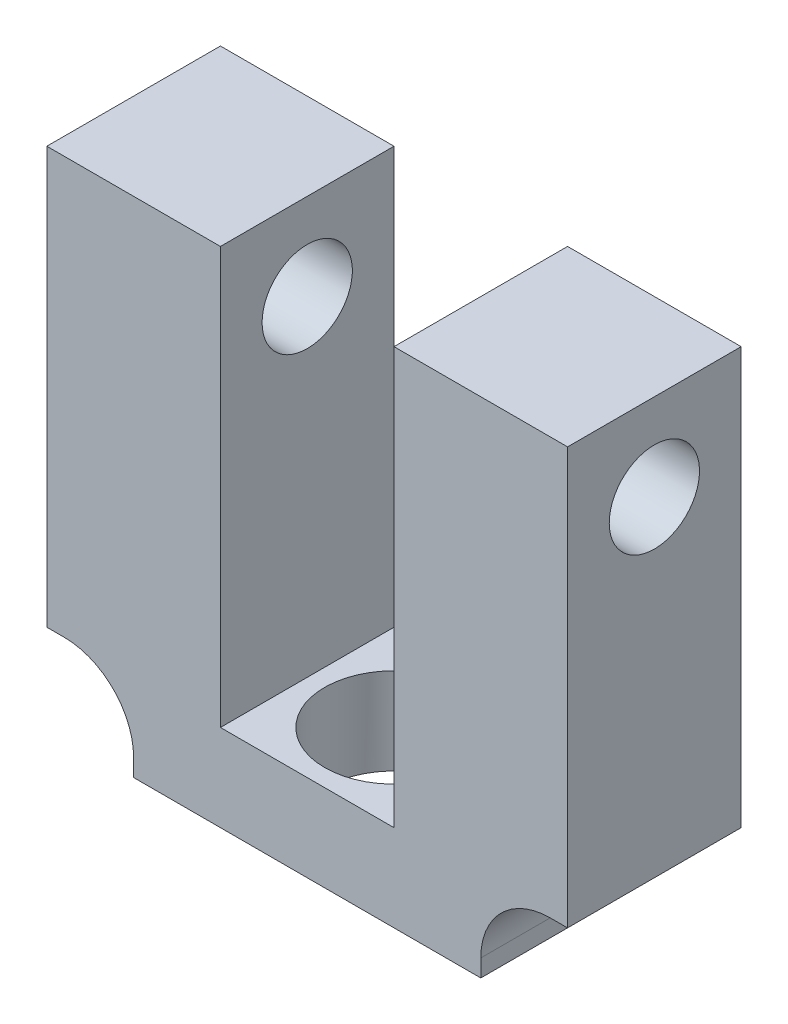
ISO-10303-21;
HEADER;
FILE_DESCRIPTION(('STEP AP214'),'2;1');
FILE_NAME('part.step','',(''),(''),'','','');
FILE_SCHEMA(('AUTOMOTIVE_DESIGN { 1 0 10303 214 1 1 1 1 }'));
ENDSEC;
DATA;
#1=APPLICATION_CONTEXT('core data for automotive mechanical design processes');
#2=APPLICATION_PROTOCOL_DEFINITION('international standard','automotive_design',2000,#1);
#3=PRODUCT_CONTEXT('',#1,'mechanical');
#4=PRODUCT('Part','Part','',(#3));
#5=PRODUCT_RELATED_PRODUCT_CATEGORY('part','',(#4));
#6=PRODUCT_DEFINITION_FORMATION('','',#4);
#7=PRODUCT_DEFINITION_CONTEXT('part definition',#1,'design');
#8=PRODUCT_DEFINITION('design','',#6,#7);
#9=PRODUCT_DEFINITION_SHAPE('','',#8);
#10=(LENGTH_UNIT() NAMED_UNIT(*) SI_UNIT(.MILLI.,.METRE.));
#11=(NAMED_UNIT(*) PLANE_ANGLE_UNIT() SI_UNIT($,.RADIAN.));
#12=(NAMED_UNIT(*) SI_UNIT($,.STERADIAN.) SOLID_ANGLE_UNIT());
#13=UNCERTAINTY_MEASURE_WITH_UNIT(LENGTH_MEASURE(1.E-05),#10,'distance_accuracy_value','');
#14=(GEOMETRIC_REPRESENTATION_CONTEXT(3) GLOBAL_UNCERTAINTY_ASSIGNED_CONTEXT((#13)) GLOBAL_UNIT_ASSIGNED_CONTEXT((#10,
#11,#12)) REPRESENTATION_CONTEXT('',''));
#15=CARTESIAN_POINT('',(0.,0.,0.));
#16=DIRECTION('',(0.,0.,1.));
#17=DIRECTION('',(1.,0.,0.));
#18=AXIS2_PLACEMENT_3D('',#15,#16,#17);
#19=CARTESIAN_POINT('',(0.,3.175,0.));
#20=DIRECTION('',(0.,-1.,0.));
#21=DIRECTION('',(0.,0.,-1.));
#22=AXIS2_PLACEMENT_3D('',#19,#20,#21);
#23=PLANE('',#22);
#24=CARTESIAN_POINT('',(6.35,3.175,-3.175));
#25=DIRECTION('',(0.,1.,0.));
#26=DIRECTION('',(0.,0.,1.));
#27=AXIS2_PLACEMENT_3D('',#24,#25,#26);
#28=CIRCLE('',#27,2.54);
#29=CARTESIAN_POINT('',(6.35,3.175,-0.634999999999999));
#30=VERTEX_POINT('',#29);
#31=EDGE_CURVE('E259',#30,#30,#28,.T.);
#32=ORIENTED_EDGE('',*,*,#31,.F.);
#33=EDGE_LOOP('',(#32));
#34=FACE_BOUND('',#33,.T.);
#35=DIRECTION('',(0.,0.,1.));
#36=VECTOR('',#35,1.);
#37=CARTESIAN_POINT('',(9.525,3.175,-6.35));
#38=LINE('',#37,#36);
#39=CARTESIAN_POINT('',(9.525,3.175,-6.35));
#40=VERTEX_POINT('',#39);
#41=CARTESIAN_POINT('',(9.525,3.175,0.));
#42=VERTEX_POINT('',#41);
#43=EDGE_CURVE('E170',#40,#42,#38,.T.);
#44=ORIENTED_EDGE('',*,*,#43,.F.);
#45=DIRECTION('',(-1.,0.,0.));
#46=VECTOR('',#45,1.);
#47=CARTESIAN_POINT('',(0.,3.175,-6.35));
#48=LINE('',#47,#46);
#49=CARTESIAN_POINT('',(3.175,3.175,-6.35));
#50=VERTEX_POINT('',#49);
#51=EDGE_CURVE('E214',#40,#50,#48,.T.);
#52=ORIENTED_EDGE('',*,*,#51,.T.);
#53=DIRECTION('',(0.,0.,-1.));
#54=VECTOR('',#53,1.);
#55=CARTESIAN_POINT('',(3.175,3.175,-6.35));
#56=LINE('',#55,#54);
#57=CARTESIAN_POINT('',(3.175,3.175,0.));
#58=VERTEX_POINT('',#57);
#59=EDGE_CURVE('E188',#58,#50,#56,.T.);
#60=ORIENTED_EDGE('',*,*,#59,.F.);
#61=DIRECTION('',(1.,0.,0.));
#62=VECTOR('',#61,1.);
#63=CARTESIAN_POINT('',(0.,3.175,0.));
#64=LINE('',#63,#62);
#65=EDGE_CURVE('E212',#58,#42,#64,.T.);
#66=ORIENTED_EDGE('',*,*,#65,.T.);
#67=EDGE_LOOP('',(#44,#52,#60,#66));
#68=FACE_BOUND('',#67,.T.);
#69=ADVANCED_FACE('F40',(#34,#68),#23,.F.);
#70=CARTESIAN_POINT('',(0.,3.175,0.));
#71=DIRECTION('',(1.,0.,0.));
#72=DIRECTION('',(0.,0.,-1.));
#73=AXIS2_PLACEMENT_3D('',#70,#71,#72);
#74=PLANE('',#73);
#75=DIRECTION('',(0.,-1.,0.));
#76=VECTOR('',#75,1.);
#77=CARTESIAN_POINT('',(0.,3.175,0.));
#78=LINE('',#77,#76);
#79=CARTESIAN_POINT('',(0.,0.635,0.));
#80=VERTEX_POINT('',#79);
#81=CARTESIAN_POINT('',(0.,0.,0.));
#82=VERTEX_POINT('',#81);
#83=EDGE_CURVE('E232',#80,#82,#78,.T.);
#84=ORIENTED_EDGE('',*,*,#83,.F.);
#85=DIRECTION('',(0.,0.,1.));
#86=VECTOR('',#85,1.);
#87=CARTESIAN_POINT('',(0.,0.635,-6.35));
#88=LINE('',#87,#86);
#89=CARTESIAN_POINT('',(0.,0.635,-6.35));
#90=VERTEX_POINT('',#89);
#91=EDGE_CURVE('E57',#80,#90,#88,.F.);
#92=ORIENTED_EDGE('',*,*,#91,.T.);
#93=DIRECTION('',(0.,-1.,0.));
#94=VECTOR('',#93,1.);
#95=CARTESIAN_POINT('',(0.,3.175,-6.35));
#96=LINE('',#95,#94);
#97=CARTESIAN_POINT('',(0.,0.,-6.35));
#98=VERTEX_POINT('',#97);
#99=EDGE_CURVE('E217',#90,#98,#96,.T.);
#100=ORIENTED_EDGE('',*,*,#99,.T.);
#101=DIRECTION('',(0.,0.,1.));
#102=VECTOR('',#101,1.);
#103=CARTESIAN_POINT('',(0.,0.,0.));
#104=LINE('',#103,#102);
#105=EDGE_CURVE('E211',#98,#82,#104,.T.);
#106=ORIENTED_EDGE('',*,*,#105,.T.);
#107=EDGE_LOOP('',(#84,#92,#100,#106));
#108=FACE_BOUND('',#107,.T.);
#109=ADVANCED_FACE('F327',(#108),#74,.F.);
#110=CARTESIAN_POINT('',(0.,3.175,0.));
#111=DIRECTION('',(0.,0.,-1.));
#112=DIRECTION('',(-1.,0.,0.));
#113=AXIS2_PLACEMENT_3D('',#110,#111,#112);
#114=PLANE('',#113);
#115=DIRECTION('',(1.,0.,0.));
#116=VECTOR('',#115,1.);
#117=CARTESIAN_POINT('',(0.,0.,0.));
#118=LINE('',#117,#116);
#119=CARTESIAN_POINT('',(12.7,0.,0.));
#120=VERTEX_POINT('',#119);
#121=EDGE_CURVE('E220',#82,#120,#118,.T.);
#122=ORIENTED_EDGE('',*,*,#121,.T.);
#123=DIRECTION('',(0.,-1.,0.));
#124=VECTOR('',#123,1.);
#125=CARTESIAN_POINT('',(12.7,3.175,0.));
#126=LINE('',#125,#124);
#127=CARTESIAN_POINT('',(12.7,0.635,0.));
#128=VERTEX_POINT('',#127);
#129=EDGE_CURVE('E230',#128,#120,#126,.T.);
#130=ORIENTED_EDGE('',*,*,#129,.F.);
#131=CARTESIAN_POINT('',(15.24,0.635,0.));
#132=DIRECTION('',(0.,0.,-1.));
#133=DIRECTION('',(-1.,0.,0.));
#134=AXIS2_PLACEMENT_3D('',#131,#132,#133);
#135=CIRCLE('',#134,2.54);
#136=CARTESIAN_POINT('',(15.24,3.175,0.));
#137=VERTEX_POINT('',#136);
#138=EDGE_CURVE('E243',#128,#137,#135,.T.);
#139=ORIENTED_EDGE('',*,*,#138,.T.);
#140=DIRECTION('',(1.,0.,0.));
#141=VECTOR('',#140,1.);
#142=CARTESIAN_POINT('',(9.525,3.175,0.));
#143=LINE('',#142,#141);
#144=CARTESIAN_POINT('',(15.875,3.175,0.));
#145=VERTEX_POINT('',#144);
#146=EDGE_CURVE('E153',#137,#145,#143,.T.);
#147=ORIENTED_EDGE('',*,*,#146,.T.);
#148=DIRECTION('',(0.,-1.,0.));
#149=VECTOR('',#148,1.);
#150=CARTESIAN_POINT('',(15.875,18.415,0.));
#151=LINE('',#150,#149);
#152=CARTESIAN_POINT('',(15.875,18.415,0.));
#153=VERTEX_POINT('',#152);
#154=EDGE_CURVE('E149',#153,#145,#151,.T.);
#155=ORIENTED_EDGE('',*,*,#154,.F.);
#156=DIRECTION('',(1.,0.,0.));
#157=VECTOR('',#156,1.);
#158=CARTESIAN_POINT('',(9.525,18.415,0.));
#159=LINE('',#158,#157);
#160=CARTESIAN_POINT('',(9.525,18.415,0.));
#161=VERTEX_POINT('',#160);
#162=EDGE_CURVE('E179',#161,#153,#159,.T.);
#163=ORIENTED_EDGE('',*,*,#162,.F.);
#164=DIRECTION('',(0.,-1.,0.));
#165=VECTOR('',#164,1.);
#166=CARTESIAN_POINT('',(9.525,18.415,0.));
#167=LINE('',#166,#165);
#168=EDGE_CURVE('E267',#161,#42,#167,.T.);
#169=ORIENTED_EDGE('',*,*,#168,.T.);
#170=ORIENTED_EDGE('',*,*,#65,.F.);
#171=DIRECTION('',(0.,-1.,0.));
#172=VECTOR('',#171,1.);
#173=CARTESIAN_POINT('',(3.175,18.415,0.));
#174=LINE('',#173,#172);
#175=CARTESIAN_POINT('',(3.175,18.415,0.));
#176=VERTEX_POINT('',#175);
#177=EDGE_CURVE('E202',#176,#58,#174,.T.);
#178=ORIENTED_EDGE('',*,*,#177,.F.);
#179=DIRECTION('',(1.,0.,0.));
#180=VECTOR('',#179,1.);
#181=CARTESIAN_POINT('',(3.175,18.415,0.));
#182=LINE('',#181,#180);
#183=CARTESIAN_POINT('',(-3.175,18.415,0.));
#184=VERTEX_POINT('',#183);
#185=EDGE_CURVE('E190',#184,#176,#182,.T.);
#186=ORIENTED_EDGE('',*,*,#185,.F.);
#187=DIRECTION('',(0.,-1.,0.));
#188=VECTOR('',#187,1.);
#189=CARTESIAN_POINT('',(-3.175,18.415,0.));
#190=LINE('',#189,#188);
#191=CARTESIAN_POINT('',(-3.175,3.175,0.));
#192=VERTEX_POINT('',#191);
#193=EDGE_CURVE('E205',#184,#192,#190,.T.);
#194=ORIENTED_EDGE('',*,*,#193,.T.);
#195=DIRECTION('',(1.,0.,0.));
#196=VECTOR('',#195,1.);
#197=CARTESIAN_POINT('',(3.175,3.175,0.));
#198=LINE('',#197,#196);
#199=CARTESIAN_POINT('',(-2.54,3.175,0.));
#200=VERTEX_POINT('',#199);
#201=EDGE_CURVE('E196',#192,#200,#198,.T.);
#202=ORIENTED_EDGE('',*,*,#201,.T.);
#203=CARTESIAN_POINT('',(-2.54,0.635,0.));
#204=DIRECTION('',(0.,0.,-1.));
#205=DIRECTION('',(-1.,0.,0.));
#206=AXIS2_PLACEMENT_3D('',#203,#204,#205);
#207=CIRCLE('',#206,2.54);
#208=EDGE_CURVE('E49',#200,#80,#207,.T.);
#209=ORIENTED_EDGE('',*,*,#208,.T.);
#210=ORIENTED_EDGE('',*,*,#83,.T.);
#211=EDGE_LOOP('',(#122,#130,#139,#147,#155,#163,#169,#170,#178,#186,#194,#202,#209,#210));
#212=FACE_BOUND('',#211,.T.);
#213=ADVANCED_FACE('F270',(#212),#114,.F.);
#214=CARTESIAN_POINT('',(12.7,3.175,0.));
#215=DIRECTION('',(-1.,0.,0.));
#216=DIRECTION('',(0.,0.,1.));
#217=AXIS2_PLACEMENT_3D('',#214,#215,#216);
#218=PLANE('',#217);
#219=DIRECTION('',(0.,-1.,0.));
#220=VECTOR('',#219,1.);
#221=CARTESIAN_POINT('',(12.7,3.175,-6.35));
#222=LINE('',#221,#220);
#223=CARTESIAN_POINT('',(12.7,0.635,-6.35));
#224=VERTEX_POINT('',#223);
#225=CARTESIAN_POINT('',(12.7,0.,-6.35));
#226=VERTEX_POINT('',#225);
#227=EDGE_CURVE('E228',#224,#226,#222,.T.);
#228=ORIENTED_EDGE('',*,*,#227,.F.);
#229=DIRECTION('',(0.,0.,-1.));
#230=VECTOR('',#229,1.);
#231=CARTESIAN_POINT('',(12.7,0.635,0.));
#232=LINE('',#231,#230);
#233=EDGE_CURVE('E235',#224,#128,#232,.F.);
#234=ORIENTED_EDGE('',*,*,#233,.T.);
#235=ORIENTED_EDGE('',*,*,#129,.T.);
#236=DIRECTION('',(0.,0.,-1.));
#237=VECTOR('',#236,1.);
#238=CARTESIAN_POINT('',(12.7,0.,0.));
#239=LINE('',#238,#237);
#240=EDGE_CURVE('E223',#120,#226,#239,.T.);
#241=ORIENTED_EDGE('',*,*,#240,.T.);
#242=EDGE_LOOP('',(#228,#234,#235,#241));
#243=FACE_BOUND('',#242,.T.);
#244=ADVANCED_FACE('F279',(#243),#218,.F.);
#245=CARTESIAN_POINT('',(0.,3.175,-6.35));
#246=DIRECTION('',(0.,0.,1.));
#247=DIRECTION('',(1.,0.,0.));
#248=AXIS2_PLACEMENT_3D('',#245,#246,#247);
#249=PLANE('',#248);
#250=DIRECTION('',(-1.,0.,0.));
#251=VECTOR('',#250,1.);
#252=CARTESIAN_POINT('',(0.,0.,-6.35));
#253=LINE('',#252,#251);
#254=EDGE_CURVE('E215',#226,#98,#253,.T.);
#255=ORIENTED_EDGE('',*,*,#254,.T.);
#256=ORIENTED_EDGE('',*,*,#99,.F.);
#257=CARTESIAN_POINT('',(-2.54,0.635,-6.35));
#258=DIRECTION('',(0.,0.,1.));
#259=DIRECTION('',(1.,0.,0.));
#260=AXIS2_PLACEMENT_3D('',#257,#258,#259);
#261=CIRCLE('',#260,2.54);
#262=CARTESIAN_POINT('',(-2.54,3.175,-6.35));
#263=VERTEX_POINT('',#262);
#264=EDGE_CURVE('E11',#90,#263,#261,.T.);
#265=ORIENTED_EDGE('',*,*,#264,.T.);
#266=DIRECTION('',(-1.,0.,0.));
#267=VECTOR('',#266,1.);
#268=CARTESIAN_POINT('',(3.175,3.175,-6.35));
#269=LINE('',#268,#267);
#270=CARTESIAN_POINT('',(-3.175,3.175,-6.35));
#271=VERTEX_POINT('',#270);
#272=EDGE_CURVE('E169',#263,#271,#269,.T.);
#273=ORIENTED_EDGE('',*,*,#272,.T.);
#274=DIRECTION('',(0.,-1.,0.));
#275=VECTOR('',#274,1.);
#276=CARTESIAN_POINT('',(-3.175,18.415,-6.35));
#277=LINE('',#276,#275);
#278=CARTESIAN_POINT('',(-3.175,18.415,-6.35));
#279=VERTEX_POINT('',#278);
#280=EDGE_CURVE('E208',#279,#271,#277,.T.);
#281=ORIENTED_EDGE('',*,*,#280,.F.);
#282=DIRECTION('',(-1.,0.,0.));
#283=VECTOR('',#282,1.);
#284=CARTESIAN_POINT('',(3.175,18.415,-6.35));
#285=LINE('',#284,#283);
#286=CARTESIAN_POINT('',(3.175,18.415,-6.35));
#287=VERTEX_POINT('',#286);
#288=EDGE_CURVE('E184',#287,#279,#285,.T.);
#289=ORIENTED_EDGE('',*,*,#288,.F.);
#290=DIRECTION('',(0.,-1.,0.));
#291=VECTOR('',#290,1.);
#292=CARTESIAN_POINT('',(3.175,18.415,-6.35));
#293=LINE('',#292,#291);
#294=EDGE_CURVE('E193',#287,#50,#293,.T.);
#295=ORIENTED_EDGE('',*,*,#294,.T.);
#296=ORIENTED_EDGE('',*,*,#51,.F.);
#297=DIRECTION('',(0.,-1.,0.));
#298=VECTOR('',#297,1.);
#299=CARTESIAN_POINT('',(9.525,18.415,-6.35));
#300=LINE('',#299,#298);
#301=CARTESIAN_POINT('',(9.525,18.415,-6.35));
#302=VERTEX_POINT('',#301);
#303=EDGE_CURVE('E264',#302,#40,#300,.T.);
#304=ORIENTED_EDGE('',*,*,#303,.F.);
#305=DIRECTION('',(-1.,0.,0.));
#306=VECTOR('',#305,1.);
#307=CARTESIAN_POINT('',(9.525,18.415,-6.35));
#308=LINE('',#307,#306);
#309=CARTESIAN_POINT('',(15.875,18.415,-6.35));
#310=VERTEX_POINT('',#309);
#311=EDGE_CURVE('E154',#310,#302,#308,.T.);
#312=ORIENTED_EDGE('',*,*,#311,.F.);
#313=DIRECTION('',(0.,-1.,0.));
#314=VECTOR('',#313,1.);
#315=CARTESIAN_POINT('',(15.875,18.415,-6.35));
#316=LINE('',#315,#314);
#317=CARTESIAN_POINT('',(15.875,3.175,-6.35));
#318=VERTEX_POINT('',#317);
#319=EDGE_CURVE('E146',#310,#318,#316,.T.);
#320=ORIENTED_EDGE('',*,*,#319,.T.);
#321=DIRECTION('',(-1.,0.,0.));
#322=VECTOR('',#321,1.);
#323=CARTESIAN_POINT('',(9.525,3.175,-6.35));
#324=LINE('',#323,#322);
#325=CARTESIAN_POINT('',(15.24,3.175,-6.35));
#326=VERTEX_POINT('',#325);
#327=EDGE_CURVE('E160',#318,#326,#324,.T.);
#328=ORIENTED_EDGE('',*,*,#327,.T.);
#329=CARTESIAN_POINT('',(15.24,0.635,-6.35));
#330=DIRECTION('',(0.,0.,1.));
#331=DIRECTION('',(1.,0.,0.));
#332=AXIS2_PLACEMENT_3D('',#329,#330,#331);
#333=CIRCLE('',#332,2.54);
#334=EDGE_CURVE('E241',#326,#224,#333,.T.);
#335=ORIENTED_EDGE('',*,*,#334,.T.);
#336=ORIENTED_EDGE('',*,*,#227,.T.);
#337=EDGE_LOOP('',(#255,#256,#265,#273,#281,#289,#295,#296,#304,#312,#320,#328,#335,#336));
#338=FACE_BOUND('',#337,.T.);
#339=ADVANCED_FACE('F159',(#338),#249,.F.);
#340=CARTESIAN_POINT('',(0.,0.,0.));
#341=DIRECTION('',(0.,-1.,0.));
#342=DIRECTION('',(0.,0.,-1.));
#343=AXIS2_PLACEMENT_3D('',#340,#341,#342);
#344=PLANE('',#343);
#345=CARTESIAN_POINT('',(6.35,0.,-3.175));
#346=DIRECTION('',(0.,-1.,0.));
#347=DIRECTION('',(0.,0.,-1.));
#348=AXIS2_PLACEMENT_3D('',#345,#346,#347);
#349=CIRCLE('',#348,2.54);
#350=CARTESIAN_POINT('',(6.35,0.,-5.715));
#351=VERTEX_POINT('',#350);
#352=EDGE_CURVE('E44',#351,#351,#349,.T.);
#353=ORIENTED_EDGE('',*,*,#352,.F.);
#354=EDGE_LOOP('',(#353));
#355=FACE_BOUND('',#354,.T.);
#356=ORIENTED_EDGE('',*,*,#105,.F.);
#357=ORIENTED_EDGE('',*,*,#254,.F.);
#358=ORIENTED_EDGE('',*,*,#240,.F.);
#359=ORIENTED_EDGE('',*,*,#121,.F.);
#360=EDGE_LOOP('',(#356,#357,#358,#359));
#361=FACE_BOUND('',#360,.T.);
#362=ADVANCED_FACE('F285',(#355,#361),#344,.T.);
#363=CARTESIAN_POINT('',(0.,3.175,0.));
#364=DIRECTION('',(0.,1.,0.));
#365=DIRECTION('',(0.,0.,1.));
#366=AXIS2_PLACEMENT_3D('',#363,#364,#365);
#367=PLANE('',#366);
#368=ORIENTED_EDGE('',*,*,#272,.F.);
#369=DIRECTION('',(0.,0.,1.));
#370=VECTOR('',#369,1.);
#371=CARTESIAN_POINT('',(-2.54,3.175,0.));
#372=LINE('',#371,#370);
#373=EDGE_CURVE('E237',#263,#200,#372,.T.);
#374=ORIENTED_EDGE('',*,*,#373,.T.);
#375=ORIENTED_EDGE('',*,*,#201,.F.);
#376=DIRECTION('',(0.,0.,1.));
#377=VECTOR('',#376,1.);
#378=CARTESIAN_POINT('',(-3.175,3.175,-6.35));
#379=LINE('',#378,#377);
#380=EDGE_CURVE('E172',#271,#192,#379,.T.);
#381=ORIENTED_EDGE('',*,*,#380,.F.);
#382=EDGE_LOOP('',(#368,#374,#375,#381));
#383=FACE_BOUND('',#382,.T.);
#384=ADVANCED_FACE('F292',(#383),#367,.F.);
#385=CARTESIAN_POINT('',(-3.175,18.415,-6.35));
#386=DIRECTION('',(1.,0.,0.));
#387=DIRECTION('',(0.,0.,-1.));
#388=AXIS2_PLACEMENT_3D('',#385,#386,#387);
#389=PLANE('',#388);
#390=CARTESIAN_POINT('',(-3.175,15.24,-3.175));
#391=DIRECTION('',(-1.,0.,0.));
#392=DIRECTION('',(0.,0.,1.));
#393=AXIS2_PLACEMENT_3D('',#390,#391,#392);
#394=CIRCLE('',#393,1.651);
#395=CARTESIAN_POINT('',(-3.175,15.24,-1.524));
#396=VERTEX_POINT('',#395);
#397=EDGE_CURVE('E248',#396,#396,#394,.T.);
#398=ORIENTED_EDGE('',*,*,#397,.F.);
#399=EDGE_LOOP('',(#398));
#400=FACE_BOUND('',#399,.T.);
#401=ORIENTED_EDGE('',*,*,#380,.T.);
#402=ORIENTED_EDGE('',*,*,#193,.F.);
#403=DIRECTION('',(0.,0.,1.));
#404=VECTOR('',#403,1.);
#405=CARTESIAN_POINT('',(-3.175,18.415,-6.35));
#406=LINE('',#405,#404);
#407=EDGE_CURVE('E187',#279,#184,#406,.T.);
#408=ORIENTED_EDGE('',*,*,#407,.F.);
#409=ORIENTED_EDGE('',*,*,#280,.T.);
#410=EDGE_LOOP('',(#401,#402,#408,#409));
#411=FACE_BOUND('',#410,.T.);
#412=ADVANCED_FACE('F298',(#400,#411),#389,.F.);
#413=CARTESIAN_POINT('',(3.175,18.415,-6.35));
#414=DIRECTION('',(-1.,0.,0.));
#415=DIRECTION('',(0.,0.,1.));
#416=AXIS2_PLACEMENT_3D('',#413,#414,#415);
#417=PLANE('',#416);
#418=CARTESIAN_POINT('',(3.175,15.24,-3.175));
#419=DIRECTION('',(-1.,0.,0.));
#420=DIRECTION('',(0.,0.,1.));
#421=AXIS2_PLACEMENT_3D('',#418,#419,#420);
#422=CIRCLE('',#421,1.651);
#423=CARTESIAN_POINT('',(3.175,15.24,-1.524));
#424=VERTEX_POINT('',#423);
#425=EDGE_CURVE('E252',#424,#424,#422,.T.);
#426=ORIENTED_EDGE('',*,*,#425,.T.);
#427=EDGE_LOOP('',(#426));
#428=FACE_BOUND('',#427,.T.);
#429=ORIENTED_EDGE('',*,*,#59,.T.);
#430=ORIENTED_EDGE('',*,*,#294,.F.);
#431=DIRECTION('',(0.,0.,-1.));
#432=VECTOR('',#431,1.);
#433=CARTESIAN_POINT('',(3.175,18.415,-6.35));
#434=LINE('',#433,#432);
#435=EDGE_CURVE('E192',#176,#287,#434,.T.);
#436=ORIENTED_EDGE('',*,*,#435,.F.);
#437=ORIENTED_EDGE('',*,*,#177,.T.);
#438=EDGE_LOOP('',(#429,#430,#436,#437));
#439=FACE_BOUND('',#438,.T.);
#440=ADVANCED_FACE('F306',(#428,#439),#417,.F.);
#441=CARTESIAN_POINT('',(0.,18.415,0.));
#442=DIRECTION('',(0.,1.,0.));
#443=DIRECTION('',(0.,0.,1.));
#444=AXIS2_PLACEMENT_3D('',#441,#442,#443);
#445=PLANE('',#444);
#446=ORIENTED_EDGE('',*,*,#288,.T.);
#447=ORIENTED_EDGE('',*,*,#407,.T.);
#448=ORIENTED_EDGE('',*,*,#185,.T.);
#449=ORIENTED_EDGE('',*,*,#435,.T.);
#450=EDGE_LOOP('',(#446,#447,#448,#449));
#451=FACE_BOUND('',#450,.T.);
#452=ADVANCED_FACE('F303',(#451),#445,.T.);
#453=CARTESIAN_POINT('',(0.,3.175,0.));
#454=DIRECTION('',(0.,-1.,0.));
#455=DIRECTION('',(0.,0.,-1.));
#456=AXIS2_PLACEMENT_3D('',#453,#454,#455);
#457=PLANE('',#456);
#458=ORIENTED_EDGE('',*,*,#146,.F.);
#459=DIRECTION('',(0.,0.,-1.));
#460=VECTOR('',#459,1.);
#461=CARTESIAN_POINT('',(15.24,3.175,0.));
#462=LINE('',#461,#460);
#463=EDGE_CURVE('E168',#137,#326,#462,.T.);
#464=ORIENTED_EDGE('',*,*,#463,.T.);
#465=ORIENTED_EDGE('',*,*,#327,.F.);
#466=DIRECTION('',(0.,0.,-1.));
#467=VECTOR('',#466,1.);
#468=CARTESIAN_POINT('',(15.875,3.175,-6.35));
#469=LINE('',#468,#467);
#470=EDGE_CURVE('E142',#145,#318,#469,.T.);
#471=ORIENTED_EDGE('',*,*,#470,.F.);
#472=EDGE_LOOP('',(#458,#464,#465,#471));
#473=FACE_BOUND('',#472,.T.);
#474=ADVANCED_FACE('F166',(#473),#457,.T.);
#475=CARTESIAN_POINT('',(9.525,18.415,-6.35));
#476=DIRECTION('',(1.,0.,0.));
#477=DIRECTION('',(0.,0.,-1.));
#478=AXIS2_PLACEMENT_3D('',#475,#476,#477);
#479=PLANE('',#478);
#480=CARTESIAN_POINT('',(9.525,15.24,-3.175));
#481=DIRECTION('',(1.,0.,0.));
#482=DIRECTION('',(0.,0.,-1.));
#483=AXIS2_PLACEMENT_3D('',#480,#481,#482);
#484=CIRCLE('',#483,1.651);
#485=CARTESIAN_POINT('',(9.525,15.24,-1.524));
#486=VERTEX_POINT('',#485);
#487=EDGE_CURVE('E247',#486,#486,#484,.T.);
#488=ORIENTED_EDGE('',*,*,#487,.T.);
#489=EDGE_LOOP('',(#488));
#490=FACE_BOUND('',#489,.T.);
#491=ORIENTED_EDGE('',*,*,#43,.T.);
#492=ORIENTED_EDGE('',*,*,#168,.F.);
#493=DIRECTION('',(0.,0.,1.));
#494=VECTOR('',#493,1.);
#495=CARTESIAN_POINT('',(9.525,18.415,-6.35));
#496=LINE('',#495,#494);
#497=EDGE_CURVE('E181',#302,#161,#496,.T.);
#498=ORIENTED_EDGE('',*,*,#497,.F.);
#499=ORIENTED_EDGE('',*,*,#303,.T.);
#500=EDGE_LOOP('',(#491,#492,#498,#499));
#501=FACE_BOUND('',#500,.T.);
#502=ADVANCED_FACE('F312',(#490,#501),#479,.F.);
#503=CARTESIAN_POINT('',(15.875,18.415,-6.35));
#504=DIRECTION('',(-1.,0.,0.));
#505=DIRECTION('',(0.,0.,1.));
#506=AXIS2_PLACEMENT_3D('',#503,#504,#505);
#507=PLANE('',#506);
#508=CARTESIAN_POINT('',(15.875,15.24,-3.175));
#509=DIRECTION('',(-1.,0.,0.));
#510=DIRECTION('',(0.,0.,1.));
#511=AXIS2_PLACEMENT_3D('',#508,#509,#510);
#512=CIRCLE('',#511,1.651);
#513=CARTESIAN_POINT('',(15.875,15.24,-1.524));
#514=VERTEX_POINT('',#513);
#515=EDGE_CURVE('E245',#514,#514,#512,.T.);
#516=ORIENTED_EDGE('',*,*,#515,.T.);
#517=EDGE_LOOP('',(#516));
#518=FACE_BOUND('',#517,.T.);
#519=ORIENTED_EDGE('',*,*,#470,.T.);
#520=ORIENTED_EDGE('',*,*,#319,.F.);
#521=DIRECTION('',(0.,0.,-1.));
#522=VECTOR('',#521,1.);
#523=CARTESIAN_POINT('',(15.875,18.415,-6.35));
#524=LINE('',#523,#522);
#525=EDGE_CURVE('E163',#153,#310,#524,.T.);
#526=ORIENTED_EDGE('',*,*,#525,.F.);
#527=ORIENTED_EDGE('',*,*,#154,.T.);
#528=EDGE_LOOP('',(#519,#520,#526,#527));
#529=FACE_BOUND('',#528,.T.);
#530=ADVANCED_FACE('F144',(#518,#529),#507,.F.);
#531=CARTESIAN_POINT('',(0.,18.415,0.));
#532=DIRECTION('',(0.,-1.,0.));
#533=DIRECTION('',(0.,0.,-1.));
#534=AXIS2_PLACEMENT_3D('',#531,#532,#533);
#535=PLANE('',#534);
#536=ORIENTED_EDGE('',*,*,#311,.T.);
#537=ORIENTED_EDGE('',*,*,#497,.T.);
#538=ORIENTED_EDGE('',*,*,#162,.T.);
#539=ORIENTED_EDGE('',*,*,#525,.T.);
#540=EDGE_LOOP('',(#536,#537,#538,#539));
#541=FACE_BOUND('',#540,.T.);
#542=ADVANCED_FACE('F314',(#541),#535,.F.);
#543=CARTESIAN_POINT('',(15.24,0.635,0.));
#544=DIRECTION('',(0.,0.,-1.));
#545=DIRECTION('',(-1.,0.,0.));
#546=AXIS2_PLACEMENT_3D('',#543,#544,#545);
#547=CYLINDRICAL_SURFACE('',#546,2.54);
#548=ORIENTED_EDGE('',*,*,#138,.F.);
#549=ORIENTED_EDGE('',*,*,#233,.F.);
#550=ORIENTED_EDGE('',*,*,#334,.F.);
#551=ORIENTED_EDGE('',*,*,#463,.F.);
#552=EDGE_LOOP('',(#548,#549,#550,#551));
#553=FACE_BOUND('',#552,.T.);
#554=ADVANCED_FACE('F275',(#553),#547,.F.);
#555=CARTESIAN_POINT('',(-2.54,0.635,0.));
#556=DIRECTION('',(0.,0.,-1.));
#557=DIRECTION('',(-1.,0.,0.));
#558=AXIS2_PLACEMENT_3D('',#555,#556,#557);
#559=CYLINDRICAL_SURFACE('',#558,2.54);
#560=ORIENTED_EDGE('',*,*,#264,.F.);
#561=ORIENTED_EDGE('',*,*,#91,.F.);
#562=ORIENTED_EDGE('',*,*,#208,.F.);
#563=ORIENTED_EDGE('',*,*,#373,.F.);
#564=EDGE_LOOP('',(#560,#561,#562,#563));
#565=FACE_BOUND('',#564,.T.);
#566=ADVANCED_FACE('F42',(#565),#559,.F.);
#567=CARTESIAN_POINT('',(19.431,15.24,-3.175));
#568=DIRECTION('',(-1.,0.,0.));
#569=DIRECTION('',(0.,0.,1.));
#570=AXIS2_PLACEMENT_3D('',#567,#568,#569);
#571=CYLINDRICAL_SURFACE('',#570,1.651);
#572=CARTESIAN_POINT('',(15.875,15.24,-1.524));
#573=CARTESIAN_POINT('',(15.8088541666667,15.24,-1.524));
#574=CARTESIAN_POINT('',(15.7427083333333,15.24,-1.524));
#575=CARTESIAN_POINT('',(15.6104166666667,15.24,-1.524));
#576=CARTESIAN_POINT('',(15.5442708333333,15.24,-1.524));
#577=CARTESIAN_POINT('',(15.4119791666667,15.24,-1.524));
#578=CARTESIAN_POINT('',(15.3458333333333,15.24,-1.524));
#579=CARTESIAN_POINT('',(15.2135416666667,15.24,-1.524));
#580=CARTESIAN_POINT('',(15.1473958333333,15.24,-1.524));
#581=CARTESIAN_POINT('',(15.0151041666667,15.24,-1.524));
#582=CARTESIAN_POINT('',(14.9489583333333,15.24,-1.524));
#583=CARTESIAN_POINT('',(14.8166666666667,15.24,-1.524));
#584=CARTESIAN_POINT('',(14.7505208333333,15.24,-1.524));
#585=CARTESIAN_POINT('',(14.6182291666667,15.24,-1.524));
#586=CARTESIAN_POINT('',(14.5520833333333,15.24,-1.524));
#587=CARTESIAN_POINT('',(14.4197916666667,15.24,-1.524));
#588=CARTESIAN_POINT('',(14.3536458333333,15.24,-1.524));
#589=CARTESIAN_POINT('',(14.2213541666667,15.24,-1.524));
#590=CARTESIAN_POINT('',(14.1552083333333,15.24,-1.524));
#591=CARTESIAN_POINT('',(14.0229166666667,15.24,-1.524));
#592=CARTESIAN_POINT('',(13.9567708333333,15.24,-1.524));
#593=CARTESIAN_POINT('',(13.8244791666667,15.24,-1.524));
#594=CARTESIAN_POINT('',(13.7583333333333,15.24,-1.524));
#595=CARTESIAN_POINT('',(13.6260416666667,15.24,-1.524));
#596=CARTESIAN_POINT('',(13.5598958333333,15.24,-1.524));
#597=CARTESIAN_POINT('',(13.4276041666667,15.24,-1.524));
#598=CARTESIAN_POINT('',(13.3614583333333,15.24,-1.524));
#599=CARTESIAN_POINT('',(13.2291666666667,15.24,-1.524));
#600=CARTESIAN_POINT('',(13.1630208333333,15.24,-1.524));
#601=CARTESIAN_POINT('',(13.0307291666667,15.24,-1.524));
#602=CARTESIAN_POINT('',(12.9645833333333,15.24,-1.524));
#603=CARTESIAN_POINT('',(12.8322916666667,15.24,-1.524));
#604=CARTESIAN_POINT('',(12.7661458333333,15.24,-1.524));
#605=CARTESIAN_POINT('',(12.6338541666667,15.24,-1.524));
#606=CARTESIAN_POINT('',(12.5677083333333,15.24,-1.524));
#607=CARTESIAN_POINT('',(12.4354166666667,15.24,-1.524));
#608=CARTESIAN_POINT('',(12.3692708333333,15.24,-1.524));
#609=CARTESIAN_POINT('',(12.2369791666667,15.24,-1.524));
#610=CARTESIAN_POINT('',(12.1708333333333,15.24,-1.524));
#611=CARTESIAN_POINT('',(12.0385416666667,15.24,-1.524));
#612=CARTESIAN_POINT('',(11.9723958333333,15.24,-1.524));
#613=CARTESIAN_POINT('',(11.8401041666667,15.24,-1.524));
#614=CARTESIAN_POINT('',(11.7739583333333,15.24,-1.524));
#615=CARTESIAN_POINT('',(11.6416666666667,15.24,-1.524));
#616=CARTESIAN_POINT('',(11.5755208333333,15.24,-1.524));
#617=CARTESIAN_POINT('',(11.4432291666667,15.24,-1.524));
#618=CARTESIAN_POINT('',(11.3770833333333,15.24,-1.524));
#619=CARTESIAN_POINT('',(11.2447916666667,15.24,-1.524));
#620=CARTESIAN_POINT('',(11.1786458333333,15.24,-1.524));
#621=CARTESIAN_POINT('',(11.0463541666667,15.24,-1.524));
#622=CARTESIAN_POINT('',(10.9802083333333,15.24,-1.524));
#623=CARTESIAN_POINT('',(10.8479166666667,15.24,-1.524));
#624=CARTESIAN_POINT('',(10.7817708333333,15.24,-1.524));
#625=CARTESIAN_POINT('',(10.6494791666667,15.24,-1.524));
#626=CARTESIAN_POINT('',(10.5833333333333,15.24,-1.524));
#627=CARTESIAN_POINT('',(10.4510416666667,15.24,-1.524));
#628=CARTESIAN_POINT('',(10.3848958333333,15.24,-1.524));
#629=CARTESIAN_POINT('',(10.2526041666667,15.24,-1.524));
#630=CARTESIAN_POINT('',(10.1864583333333,15.24,-1.524));
#631=CARTESIAN_POINT('',(10.0541666666667,15.24,-1.524));
#632=CARTESIAN_POINT('',(9.98802083333333,15.24,-1.524));
#633=CARTESIAN_POINT('',(9.85572916666666,15.24,-1.524));
#634=CARTESIAN_POINT('',(9.78958333333333,15.24,-1.524));
#635=CARTESIAN_POINT('',(9.65729166666666,15.24,-1.524));
#636=CARTESIAN_POINT('',(9.59114583333333,15.24,-1.524));
#637=CARTESIAN_POINT('',(9.525,15.24,-1.524));
#638=B_SPLINE_CURVE_WITH_KNOTS('',3,(#572,#573,#574,#575,#576,#577,#578,#579,#580,#581,#582,
#583,#584,#585,#586,#587,#588,#589,#590,#591,#592,#593,#594,#595,#596,#597,#598,#599,#600,#601,
#602,#603,#604,#605,#606,#607,#608,#609,#610,#611,#612,#613,#614,#615,#616,#617,#618,#619,#620,
#621,#622,#623,#624,#625,#626,#627,#628,#629,#630,#631,#632,#633,#634,#635,#636,#637),
.UNSPECIFIED.,.F.,.F.,(4,2,2,2,2,2,2,2,2,2,2,2,2,2,2,2,2,2,2,2,2,2,2,2,2,2,2,2,2,2,2,2,4),(0.,
0.198437499999999,0.396874999999998,0.595312499999999,0.793749999999999,0.992187499999998,
1.190625,1.3890625,1.5875,1.7859375,1.984375,2.1828125,2.38125,2.5796875,2.778125,2.9765625,
3.175,3.3734375,3.571875,3.7703125,3.96875,4.1671875,4.365625,4.5640625,4.7625,4.9609375,
5.159375,5.3578125,5.55625,5.7546875,5.953125,6.1515625,6.35),.UNSPECIFIED.);
#639=EDGE_CURVE('BSEAM390',#514,#486,#638,.T.);
#640=ORIENTED_EDGE('',*,*,#515,.F.);
#641=ORIENTED_EDGE('',*,*,#487,.F.);
#642=ORIENTED_EDGE('',*,*,#639,.T.);
#643=ORIENTED_EDGE('',*,*,#639,.F.);
#644=EDGE_LOOP('',(#640,#642,#641,#643));
#645=FACE_BOUND('',#644,.T.);
#646=ADVANCED_FACE('F390',(#645),#571,.F.);
#647=ORIENTED_EDGE('',*,*,#397,.T.);
#648=EDGE_LOOP('',(#647));
#649=FACE_BOUND('',#648,.T.);
#650=ORIENTED_EDGE('',*,*,#425,.F.);
#651=EDGE_LOOP('',(#650));
#652=FACE_BOUND('',#651,.T.);
#653=ADVANCED_FACE('F421',(#649,#652),#571,.F.);
#654=CARTESIAN_POINT('',(6.35,-19.431,-3.175));
#655=DIRECTION('',(0.,1.,0.));
#656=DIRECTION('',(0.,0.,1.));
#657=AXIS2_PLACEMENT_3D('',#654,#655,#656);
#658=CYLINDRICAL_SURFACE('',#657,2.54);
#659=ORIENTED_EDGE('',*,*,#352,.T.);
#660=EDGE_LOOP('',(#659));
#661=FACE_BOUND('',#660,.T.);
#662=ORIENTED_EDGE('',*,*,#31,.T.);
#663=EDGE_LOOP('',(#662));
#664=FACE_BOUND('',#663,.T.);
#665=ADVANCED_FACE('F429',(#661,#664),#658,.F.);
#666=CLOSED_SHELL('',(#69,#109,#213,#244,#339,#362,#384,#412,#440,#452,#474,#502,#530,#542,#554,
#566,#646,#653,#665));
#667=MANIFOLD_SOLID_BREP('B2',#666);
#668=ADVANCED_BREP_SHAPE_REPRESENTATION('',(#18,#667),#14);
#669=SHAPE_DEFINITION_REPRESENTATION(#9,#668);
ENDSEC;
END-ISO-10303-21;
